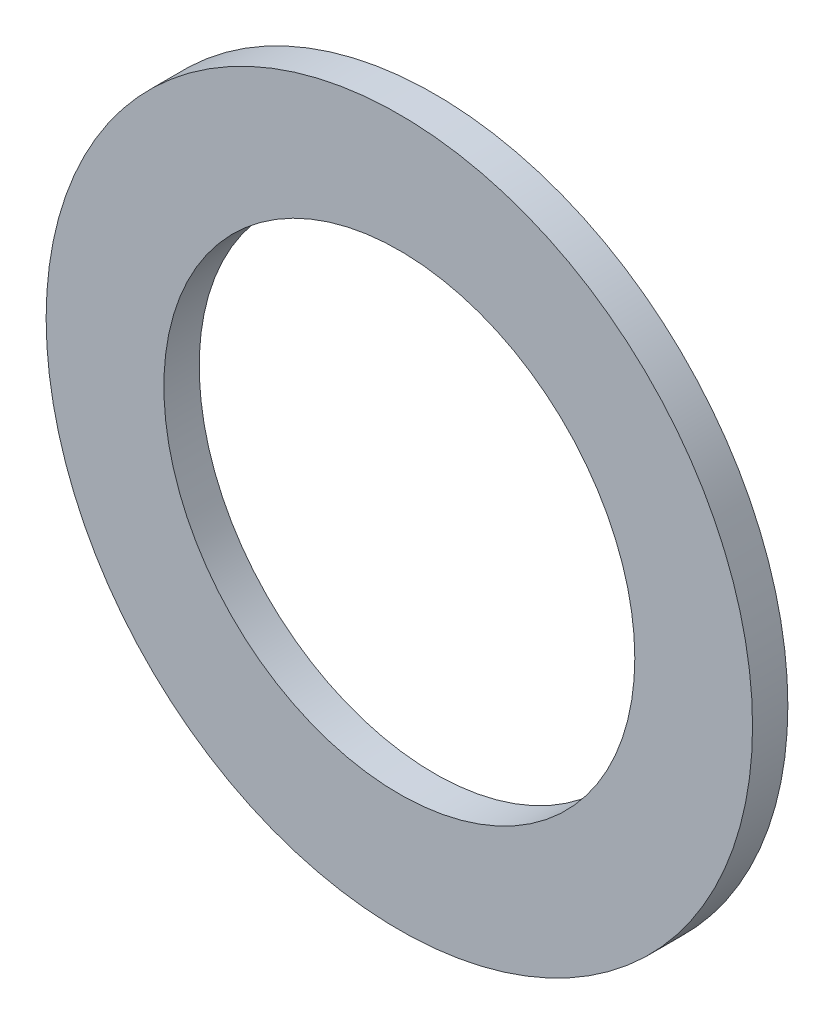
ISO-10303-21;
HEADER;
FILE_DESCRIPTION(('STEP AP214'),'2;1');
FILE_NAME('part.step','',(''),(''),'','','');
FILE_SCHEMA(('AUTOMOTIVE_DESIGN { 1 0 10303 214 1 1 1 1 }'));
ENDSEC;
DATA;
#1=APPLICATION_CONTEXT('core data for automotive mechanical design processes');
#2=APPLICATION_PROTOCOL_DEFINITION('international standard','automotive_design',2000,#1);
#3=PRODUCT_CONTEXT('',#1,'mechanical');
#4=PRODUCT('Part','Part','',(#3));
#5=PRODUCT_RELATED_PRODUCT_CATEGORY('part','',(#4));
#6=PRODUCT_DEFINITION_FORMATION('','',#4);
#7=PRODUCT_DEFINITION_CONTEXT('part definition',#1,'design');
#8=PRODUCT_DEFINITION('design','',#6,#7);
#9=PRODUCT_DEFINITION_SHAPE('','',#8);
#10=(LENGTH_UNIT() NAMED_UNIT(*) SI_UNIT(.MILLI.,.METRE.));
#11=(NAMED_UNIT(*) PLANE_ANGLE_UNIT() SI_UNIT($,.RADIAN.));
#12=(NAMED_UNIT(*) SI_UNIT($,.STERADIAN.) SOLID_ANGLE_UNIT());
#13=UNCERTAINTY_MEASURE_WITH_UNIT(LENGTH_MEASURE(1.E-05),#10,'distance_accuracy_value','');
#14=(GEOMETRIC_REPRESENTATION_CONTEXT(3) GLOBAL_UNCERTAINTY_ASSIGNED_CONTEXT((#13)) GLOBAL_UNIT_ASSIGNED_CONTEXT((#10,
#11,#12)) REPRESENTATION_CONTEXT('',''));
#15=CARTESIAN_POINT('',(0.,0.,0.));
#16=DIRECTION('',(0.,0.,1.));
#17=DIRECTION('',(1.,0.,0.));
#18=AXIS2_PLACEMENT_3D('',#15,#16,#17);
#19=CARTESIAN_POINT('',(0.,0.,0.9248248163203));
#20=DIRECTION('',(0.,0.,-1.));
#21=DIRECTION('',(1.,0.,0.));
#22=AXIS2_PLACEMENT_3D('',#19,#20,#21);
#23=CYLINDRICAL_SURFACE('',#22,1.5);
#24=CARTESIAN_POINT('',(0.,0.,0.93000000001));
#25=DIRECTION('',(0.,0.,1.));
#26=DIRECTION('',(1.,0.,0.));
#27=AXIS2_PLACEMENT_3D('',#24,#25,#26);
#28=CIRCLE('',#27,1.5);
#29=CARTESIAN_POINT('',(1.50000000001,0.,0.93000000001));
#30=VERTEX_POINT('',#29);
#31=EDGE_CURVE('E11',#30,#30,#28,.T.);
#32=ORIENTED_EDGE('',*,*,#31,.T.);
#33=CARTESIAN_POINT('',(1.5,0.,1.08000000001));
#34=CARTESIAN_POINT('',(1.5,0.,0.93000000001));
#35=B_SPLINE_CURVE_WITH_KNOTS('',1,(#33,#34),.UNSPECIFIED.,.F.,.F.,(2,2),(-0.1551751836897,
-0.0051751836897),.UNSPECIFIED.);
#36=CARTESIAN_POINT('',(1.50000000001,0.,1.08000000001));
#37=VERTEX_POINT('',#36);
#38=EDGE_CURVE('E24',#37,#30,#35,.T.);
#39=ORIENTED_EDGE('',*,*,#38,.F.);
#40=CARTESIAN_POINT('',(0.,0.,1.08000000001));
#41=DIRECTION('',(0.,0.,-1.));
#42=DIRECTION('',(1.,0.,0.));
#43=AXIS2_PLACEMENT_3D('',#40,#41,#42);
#44=CIRCLE('',#43,1.5);
#45=EDGE_CURVE('E47',#37,#37,#44,.T.);
#46=ORIENTED_EDGE('',*,*,#45,.T.);
#47=ORIENTED_EDGE('',*,*,#38,.T.);
#48=EDGE_LOOP('',(#32,#39,#46,#47));
#49=FACE_BOUND('',#48,.T.);
#50=ADVANCED_FACE('F17',(#49),#23,.T.);
#51=CARTESIAN_POINT('',(-1.56,-1.560526184092,1.08));
#52=DIRECTION('',(0.,0.,1.));
#53=DIRECTION('',(1.,0.,0.));
#54=AXIS2_PLACEMENT_3D('',#51,#52,#53);
#55=PLANE('',#54);
#56=ORIENTED_EDGE('',*,*,#45,.F.);
#57=EDGE_LOOP('',(#56));
#58=FACE_BOUND('',#57,.T.);
#59=CARTESIAN_POINT('',(0.,0.,1.08000000001));
#60=DIRECTION('',(0.,0.,1.));
#61=DIRECTION('',(1.,0.,0.));
#62=AXIS2_PLACEMENT_3D('',#59,#60,#61);
#63=CIRCLE('',#62,1.);
#64=CARTESIAN_POINT('',(1.00000000001,0.,1.08000000001));
#65=VERTEX_POINT('',#64);
#66=EDGE_CURVE('E45',#65,#65,#63,.T.);
#67=ORIENTED_EDGE('',*,*,#66,.F.);
#68=EDGE_LOOP('',(#67));
#69=FACE_BOUND('',#68,.T.);
#70=ADVANCED_FACE('F60',(#58,#69),#55,.T.);
#71=CARTESIAN_POINT('',(-1.56,-1.560526184092,0.93));
#72=DIRECTION('',(0.,0.,1.));
#73=DIRECTION('',(1.,0.,0.));
#74=AXIS2_PLACEMENT_3D('',#71,#72,#73);
#75=PLANE('',#74);
#76=ORIENTED_EDGE('',*,*,#31,.F.);
#77=EDGE_LOOP('',(#76));
#78=FACE_BOUND('',#77,.T.);
#79=CARTESIAN_POINT('',(0.,0.,0.93));
#80=DIRECTION('',(0.,0.,-1.));
#81=DIRECTION('',(1.,0.,0.));
#82=AXIS2_PLACEMENT_3D('',#79,#80,#81);
#83=CIRCLE('',#82,1.000000000661);
#84=CARTESIAN_POINT('',(1.000000000182,0.,0.929999999707));
#85=VERTEX_POINT('',#84);
#86=EDGE_CURVE('E41',#85,#85,#83,.T.);
#87=ORIENTED_EDGE('',*,*,#86,.F.);
#88=EDGE_LOOP('',(#87));
#89=FACE_BOUND('',#88,.T.);
#90=ADVANCED_FACE('F63',(#78,#89),#75,.F.);
#91=CARTESIAN_POINT('',(0.,0.,1.08));
#92=DIRECTION('',(0.,0.,1.));
#93=DIRECTION('',(-1.,0.,0.));
#94=AXIS2_PLACEMENT_3D('',#91,#92,#93);
#95=CYLINDRICAL_SURFACE('',#94,1.);
#96=CARTESIAN_POINT('',(1.,0.,0.93));
#97=CARTESIAN_POINT('',(1.,0.,1.08000000001));
#98=B_SPLINE_CURVE_WITH_KNOTS('',1,(#96,#97),.UNSPECIFIED.,.F.,.F.,(2,2),(-0.15,
1.00000008274037E-11),.UNSPECIFIED.);
#99=EDGE_CURVE('E43',#85,#65,#98,.T.);
#100=ORIENTED_EDGE('',*,*,#99,.F.);
#101=ORIENTED_EDGE('',*,*,#86,.T.);
#102=ORIENTED_EDGE('',*,*,#99,.T.);
#103=ORIENTED_EDGE('',*,*,#66,.T.);
#104=EDGE_LOOP('',(#100,#101,#102,#103));
#105=FACE_BOUND('',#104,.T.);
#106=ADVANCED_FACE('F42',(#105),#95,.F.);
#107=CLOSED_SHELL('',(#50,#70,#90,#106));
#108=MANIFOLD_SOLID_BREP('B1',#107);
#109=ADVANCED_BREP_SHAPE_REPRESENTATION('',(#18,#108),#14);
#110=SHAPE_DEFINITION_REPRESENTATION(#9,#109);
ENDSEC;
END-ISO-10303-21;
